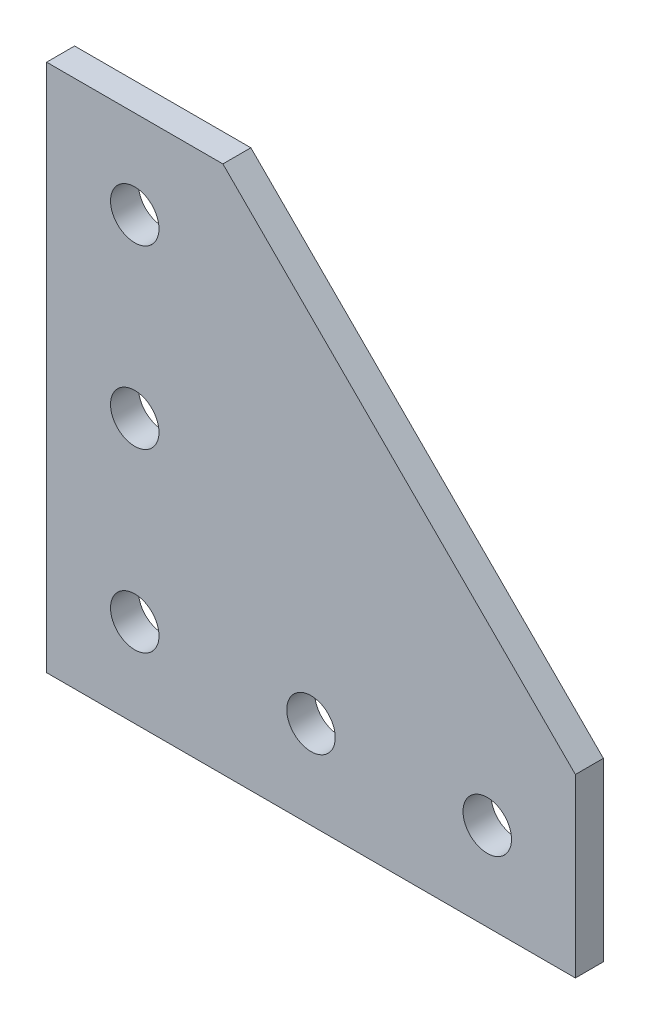
ISO-10303-21;
HEADER;
FILE_DESCRIPTION(('STEP AP214'),'2;1');
FILE_NAME('part.step','',(''),(''),'','','');
FILE_SCHEMA(('AUTOMOTIVE_DESIGN { 1 0 10303 214 1 1 1 1 }'));
ENDSEC;
DATA;
#1=APPLICATION_CONTEXT('core data for automotive mechanical design processes');
#2=APPLICATION_PROTOCOL_DEFINITION('international standard','automotive_design',2000,#1);
#3=PRODUCT_CONTEXT('',#1,'mechanical');
#4=PRODUCT('Part','Part','',(#3));
#5=PRODUCT_RELATED_PRODUCT_CATEGORY('part','',(#4));
#6=PRODUCT_DEFINITION_FORMATION('','',#4);
#7=PRODUCT_DEFINITION_CONTEXT('part definition',#1,'design');
#8=PRODUCT_DEFINITION('design','',#6,#7);
#9=PRODUCT_DEFINITION_SHAPE('','',#8);
#10=(LENGTH_UNIT() NAMED_UNIT(*) SI_UNIT(.MILLI.,.METRE.));
#11=(NAMED_UNIT(*) PLANE_ANGLE_UNIT() SI_UNIT($,.RADIAN.));
#12=(NAMED_UNIT(*) SI_UNIT($,.STERADIAN.) SOLID_ANGLE_UNIT());
#13=UNCERTAINTY_MEASURE_WITH_UNIT(LENGTH_MEASURE(1.E-05),#10,'distance_accuracy_value','');
#14=(GEOMETRIC_REPRESENTATION_CONTEXT(3) GLOBAL_UNCERTAINTY_ASSIGNED_CONTEXT((#13)) GLOBAL_UNIT_ASSIGNED_CONTEXT((#10,
#11,#12)) REPRESENTATION_CONTEXT('',''));
#15=CARTESIAN_POINT('',(0.,0.,0.));
#16=DIRECTION('',(0.,0.,1.));
#17=DIRECTION('',(1.,0.,0.));
#18=AXIS2_PLACEMENT_3D('',#15,#16,#17);
#19=CARTESIAN_POINT('',(60.,0.,3.175));
#20=DIRECTION('',(0.,1.,0.));
#21=DIRECTION('',(-1.,0.,0.));
#22=AXIS2_PLACEMENT_3D('',#19,#20,#21);
#23=PLANE('',#22);
#24=DIRECTION('',(1.,0.,0.));
#25=VECTOR('',#24,1.);
#26=CARTESIAN_POINT('',(60.,0.,0.));
#27=LINE('',#26,#25);
#28=CARTESIAN_POINT('',(0.,0.,0.));
#29=VERTEX_POINT('',#28);
#30=CARTESIAN_POINT('',(60.,0.,0.));
#31=VERTEX_POINT('',#30);
#32=EDGE_CURVE('E107',#29,#31,#27,.T.);
#33=ORIENTED_EDGE('',*,*,#32,.T.);
#34=DIRECTION('',(0.,0.,-1.));
#35=VECTOR('',#34,1.);
#36=CARTESIAN_POINT('',(60.,0.,3.175));
#37=LINE('',#36,#35);
#38=CARTESIAN_POINT('',(60.,0.,3.175));
#39=VERTEX_POINT('',#38);
#40=EDGE_CURVE('E11',#39,#31,#37,.T.);
#41=ORIENTED_EDGE('',*,*,#40,.F.);
#42=DIRECTION('',(1.,0.,0.));
#43=VECTOR('',#42,1.);
#44=CARTESIAN_POINT('',(60.,0.,3.175));
#45=LINE('',#44,#43);
#46=CARTESIAN_POINT('',(0.,0.,3.175));
#47=VERTEX_POINT('',#46);
#48=EDGE_CURVE('E116',#47,#39,#45,.T.);
#49=ORIENTED_EDGE('',*,*,#48,.F.);
#50=DIRECTION('',(0.,0.,-1.));
#51=VECTOR('',#50,1.);
#52=CARTESIAN_POINT('',(0.,0.,3.175));
#53=LINE('',#52,#51);
#54=EDGE_CURVE('E103',#47,#29,#53,.T.);
#55=ORIENTED_EDGE('',*,*,#54,.T.);
#56=EDGE_LOOP('',(#33,#41,#49,#55));
#57=FACE_BOUND('',#56,.T.);
#58=ADVANCED_FACE('F33',(#57),#23,.F.);
#59=CARTESIAN_POINT('',(60.,20.,3.175));
#60=DIRECTION('',(-1.,0.,0.));
#61=DIRECTION('',(0.,-1.,0.));
#62=AXIS2_PLACEMENT_3D('',#59,#60,#61);
#63=PLANE('',#62);
#64=DIRECTION('',(0.,1.,0.));
#65=VECTOR('',#64,1.);
#66=CARTESIAN_POINT('',(60.,20.,0.));
#67=LINE('',#66,#65);
#68=CARTESIAN_POINT('',(60.,20.,0.));
#69=VERTEX_POINT('',#68);
#70=EDGE_CURVE('E110',#31,#69,#67,.T.);
#71=ORIENTED_EDGE('',*,*,#70,.T.);
#72=DIRECTION('',(0.,0.,-1.));
#73=VECTOR('',#72,1.);
#74=CARTESIAN_POINT('',(60.,20.,3.175));
#75=LINE('',#74,#73);
#76=CARTESIAN_POINT('',(60.,20.,3.175));
#77=VERTEX_POINT('',#76);
#78=EDGE_CURVE('E41',#77,#69,#75,.T.);
#79=ORIENTED_EDGE('',*,*,#78,.F.);
#80=DIRECTION('',(0.,1.,0.));
#81=VECTOR('',#80,1.);
#82=CARTESIAN_POINT('',(60.,20.,3.175));
#83=LINE('',#82,#81);
#84=EDGE_CURVE('E83',#39,#77,#83,.T.);
#85=ORIENTED_EDGE('',*,*,#84,.F.);
#86=ORIENTED_EDGE('',*,*,#40,.T.);
#87=EDGE_LOOP('',(#71,#79,#85,#86));
#88=FACE_BOUND('',#87,.T.);
#89=ADVANCED_FACE('F136',(#88),#63,.F.);
#90=CARTESIAN_POINT('',(20.,60.,3.175));
#91=DIRECTION('',(-0.707106781186548,-0.707106781186547,0.));
#92=DIRECTION('',(0.707106781186547,-0.707106781186548,0.));
#93=AXIS2_PLACEMENT_3D('',#90,#91,#92);
#94=PLANE('',#93);
#95=DIRECTION('',(-0.707106781186547,0.707106781186548,0.));
#96=VECTOR('',#95,1.);
#97=CARTESIAN_POINT('',(20.,60.,0.));
#98=LINE('',#97,#96);
#99=CARTESIAN_POINT('',(20.,60.,0.));
#100=VERTEX_POINT('',#99);
#101=EDGE_CURVE('E98',#69,#100,#98,.T.);
#102=ORIENTED_EDGE('',*,*,#101,.T.);
#103=DIRECTION('',(0.,0.,-1.));
#104=VECTOR('',#103,1.);
#105=CARTESIAN_POINT('',(20.,60.,3.175));
#106=LINE('',#105,#104);
#107=CARTESIAN_POINT('',(20.,60.,3.175));
#108=VERTEX_POINT('',#107);
#109=EDGE_CURVE('E95',#108,#100,#106,.T.);
#110=ORIENTED_EDGE('',*,*,#109,.F.);
#111=DIRECTION('',(-0.707106781186547,0.707106781186548,0.));
#112=VECTOR('',#111,1.);
#113=CARTESIAN_POINT('',(20.,60.,3.175));
#114=LINE('',#113,#112);
#115=EDGE_CURVE('E87',#77,#108,#114,.T.);
#116=ORIENTED_EDGE('',*,*,#115,.F.);
#117=ORIENTED_EDGE('',*,*,#78,.T.);
#118=EDGE_LOOP('',(#102,#110,#116,#117));
#119=FACE_BOUND('',#118,.T.);
#120=ADVANCED_FACE('F96',(#119),#94,.F.);
#121=CARTESIAN_POINT('',(0.,60.,3.175));
#122=DIRECTION('',(0.,-1.,0.));
#123=DIRECTION('',(0.,0.,-1.));
#124=AXIS2_PLACEMENT_3D('',#121,#122,#123);
#125=PLANE('',#124);
#126=DIRECTION('',(-1.,0.,0.));
#127=VECTOR('',#126,1.);
#128=CARTESIAN_POINT('',(0.,60.,0.));
#129=LINE('',#128,#127);
#130=CARTESIAN_POINT('',(0.,60.,0.));
#131=VERTEX_POINT('',#130);
#132=EDGE_CURVE('E69',#100,#131,#129,.T.);
#133=ORIENTED_EDGE('',*,*,#132,.T.);
#134=DIRECTION('',(0.,0.,-1.));
#135=VECTOR('',#134,1.);
#136=CARTESIAN_POINT('',(0.,60.,3.175));
#137=LINE('',#136,#135);
#138=CARTESIAN_POINT('',(0.,60.,3.175));
#139=VERTEX_POINT('',#138);
#140=EDGE_CURVE('E99',#139,#131,#137,.T.);
#141=ORIENTED_EDGE('',*,*,#140,.F.);
#142=DIRECTION('',(-1.,0.,0.));
#143=VECTOR('',#142,1.);
#144=CARTESIAN_POINT('',(0.,60.,3.175));
#145=LINE('',#144,#143);
#146=EDGE_CURVE('E91',#108,#139,#145,.T.);
#147=ORIENTED_EDGE('',*,*,#146,.F.);
#148=ORIENTED_EDGE('',*,*,#109,.T.);
#149=EDGE_LOOP('',(#133,#141,#147,#148));
#150=FACE_BOUND('',#149,.T.);
#151=ADVANCED_FACE('F101',(#150),#125,.F.);
#152=CARTESIAN_POINT('',(0.,0.,3.175));
#153=DIRECTION('',(1.,0.,0.));
#154=DIRECTION('',(0.,0.,-1.));
#155=AXIS2_PLACEMENT_3D('',#152,#153,#154);
#156=PLANE('',#155);
#157=DIRECTION('',(0.,-1.,0.));
#158=VECTOR('',#157,1.);
#159=CARTESIAN_POINT('',(0.,0.,0.));
#160=LINE('',#159,#158);
#161=EDGE_CURVE('E75',#131,#29,#160,.T.);
#162=ORIENTED_EDGE('',*,*,#161,.T.);
#163=ORIENTED_EDGE('',*,*,#54,.F.);
#164=DIRECTION('',(0.,-1.,0.));
#165=VECTOR('',#164,1.);
#166=CARTESIAN_POINT('',(0.,0.,3.175));
#167=LINE('',#166,#165);
#168=EDGE_CURVE('E49',#139,#47,#167,.T.);
#169=ORIENTED_EDGE('',*,*,#168,.F.);
#170=ORIENTED_EDGE('',*,*,#140,.T.);
#171=EDGE_LOOP('',(#162,#163,#169,#170));
#172=FACE_BOUND('',#171,.T.);
#173=ADVANCED_FACE('F124',(#172),#156,.F.);
#174=CARTESIAN_POINT('',(0.,0.,3.175));
#175=DIRECTION('',(0.,0.,-1.));
#176=DIRECTION('',(-1.,0.,0.));
#177=AXIS2_PLACEMENT_3D('',#174,#175,#176);
#178=PLANE('',#177);
#179=CARTESIAN_POINT('',(10.,50.,3.175));
#180=DIRECTION('',(0.,0.,1.));
#181=DIRECTION('',(1.,0.,0.));
#182=AXIS2_PLACEMENT_3D('',#179,#180,#181);
#183=CIRCLE('',#182,2.74999999999999);
#184=CARTESIAN_POINT('',(12.75,50.,3.175));
#185=VERTEX_POINT('',#184);
#186=EDGE_CURVE('E228',#185,#185,#183,.T.);
#187=ORIENTED_EDGE('',*,*,#186,.F.);
#188=EDGE_LOOP('',(#187));
#189=FACE_BOUND('',#188,.T.);
#190=CARTESIAN_POINT('',(10.,30.,3.175));
#191=DIRECTION('',(0.,0.,1.));
#192=DIRECTION('',(1.,0.,0.));
#193=AXIS2_PLACEMENT_3D('',#190,#191,#192);
#194=CIRCLE('',#193,2.74999999999999);
#195=CARTESIAN_POINT('',(12.75,30.,3.175));
#196=VERTEX_POINT('',#195);
#197=EDGE_CURVE('E230',#196,#196,#194,.T.);
#198=ORIENTED_EDGE('',*,*,#197,.F.);
#199=EDGE_LOOP('',(#198));
#200=FACE_BOUND('',#199,.T.);
#201=CARTESIAN_POINT('',(50.,10.,3.175));
#202=DIRECTION('',(0.,0.,1.));
#203=DIRECTION('',(1.,0.,0.));
#204=AXIS2_PLACEMENT_3D('',#201,#202,#203);
#205=CIRCLE('',#204,2.74999999999999);
#206=CARTESIAN_POINT('',(52.75,10.,3.175));
#207=VERTEX_POINT('',#206);
#208=EDGE_CURVE('E238',#207,#207,#205,.T.);
#209=ORIENTED_EDGE('',*,*,#208,.F.);
#210=EDGE_LOOP('',(#209));
#211=FACE_BOUND('',#210,.T.);
#212=CARTESIAN_POINT('',(30.,10.,3.175));
#213=DIRECTION('',(0.,0.,1.));
#214=DIRECTION('',(1.,0.,0.));
#215=AXIS2_PLACEMENT_3D('',#212,#213,#214);
#216=CIRCLE('',#215,2.74999999999999);
#217=CARTESIAN_POINT('',(32.75,10.,3.175));
#218=VERTEX_POINT('',#217);
#219=EDGE_CURVE('E244',#218,#218,#216,.T.);
#220=ORIENTED_EDGE('',*,*,#219,.F.);
#221=EDGE_LOOP('',(#220));
#222=FACE_BOUND('',#221,.T.);
#223=CARTESIAN_POINT('',(10.,10.,3.175));
#224=DIRECTION('',(0.,0.,1.));
#225=DIRECTION('',(1.,0.,0.));
#226=AXIS2_PLACEMENT_3D('',#223,#224,#225);
#227=CIRCLE('',#226,2.74999999999999);
#228=CARTESIAN_POINT('',(12.75,10.,3.175));
#229=VERTEX_POINT('',#228);
#230=EDGE_CURVE('E250',#229,#229,#227,.T.);
#231=ORIENTED_EDGE('',*,*,#230,.F.);
#232=EDGE_LOOP('',(#231));
#233=FACE_BOUND('',#232,.T.);
#234=ORIENTED_EDGE('',*,*,#48,.T.);
#235=ORIENTED_EDGE('',*,*,#84,.T.);
#236=ORIENTED_EDGE('',*,*,#115,.T.);
#237=ORIENTED_EDGE('',*,*,#146,.T.);
#238=ORIENTED_EDGE('',*,*,#168,.T.);
#239=EDGE_LOOP('',(#234,#235,#236,#237,#238));
#240=FACE_BOUND('',#239,.T.);
#241=ADVANCED_FACE('F89',(#189,#200,#211,#222,#233,#240),#178,.F.);
#242=CARTESIAN_POINT('',(0.,0.,0.));
#243=DIRECTION('',(0.,0.,-1.));
#244=DIRECTION('',(-1.,0.,0.));
#245=AXIS2_PLACEMENT_3D('',#242,#243,#244);
#246=PLANE('',#245);
#247=CARTESIAN_POINT('',(10.,50.,0.));
#248=DIRECTION('',(0.,0.,1.));
#249=DIRECTION('',(1.,0.,0.));
#250=AXIS2_PLACEMENT_3D('',#247,#248,#249);
#251=CIRCLE('',#250,2.75);
#252=CARTESIAN_POINT('',(12.75,50.,0.));
#253=VERTEX_POINT('',#252);
#254=EDGE_CURVE('E225',#253,#253,#251,.T.);
#255=ORIENTED_EDGE('',*,*,#254,.T.);
#256=EDGE_LOOP('',(#255));
#257=FACE_BOUND('',#256,.T.);
#258=CARTESIAN_POINT('',(10.,30.,0.));
#259=DIRECTION('',(0.,0.,1.));
#260=DIRECTION('',(1.,0.,0.));
#261=AXIS2_PLACEMENT_3D('',#258,#259,#260);
#262=CIRCLE('',#261,2.75);
#263=CARTESIAN_POINT('',(12.75,30.,0.));
#264=VERTEX_POINT('',#263);
#265=EDGE_CURVE('E235',#264,#264,#262,.T.);
#266=ORIENTED_EDGE('',*,*,#265,.T.);
#267=EDGE_LOOP('',(#266));
#268=FACE_BOUND('',#267,.T.);
#269=CARTESIAN_POINT('',(50.,10.,0.));
#270=DIRECTION('',(0.,0.,1.));
#271=DIRECTION('',(1.,0.,0.));
#272=AXIS2_PLACEMENT_3D('',#269,#270,#271);
#273=CIRCLE('',#272,2.75);
#274=CARTESIAN_POINT('',(52.75,10.,0.));
#275=VERTEX_POINT('',#274);
#276=EDGE_CURVE('E241',#275,#275,#273,.T.);
#277=ORIENTED_EDGE('',*,*,#276,.T.);
#278=EDGE_LOOP('',(#277));
#279=FACE_BOUND('',#278,.T.);
#280=CARTESIAN_POINT('',(30.,10.,0.));
#281=DIRECTION('',(0.,0.,1.));
#282=DIRECTION('',(1.,0.,0.));
#283=AXIS2_PLACEMENT_3D('',#280,#281,#282);
#284=CIRCLE('',#283,2.75);
#285=CARTESIAN_POINT('',(32.75,10.,0.));
#286=VERTEX_POINT('',#285);
#287=EDGE_CURVE('E247',#286,#286,#284,.T.);
#288=ORIENTED_EDGE('',*,*,#287,.T.);
#289=EDGE_LOOP('',(#288));
#290=FACE_BOUND('',#289,.T.);
#291=CARTESIAN_POINT('',(10.,10.,0.));
#292=DIRECTION('',(0.,0.,1.));
#293=DIRECTION('',(1.,0.,0.));
#294=AXIS2_PLACEMENT_3D('',#291,#292,#293);
#295=CIRCLE('',#294,2.75);
#296=CARTESIAN_POINT('',(12.75,10.,0.));
#297=VERTEX_POINT('',#296);
#298=EDGE_CURVE('E111',#297,#297,#295,.T.);
#299=ORIENTED_EDGE('',*,*,#298,.T.);
#300=EDGE_LOOP('',(#299));
#301=FACE_BOUND('',#300,.T.);
#302=ORIENTED_EDGE('',*,*,#32,.F.);
#303=ORIENTED_EDGE('',*,*,#161,.F.);
#304=ORIENTED_EDGE('',*,*,#132,.F.);
#305=ORIENTED_EDGE('',*,*,#101,.F.);
#306=ORIENTED_EDGE('',*,*,#70,.F.);
#307=EDGE_LOOP('',(#302,#303,#304,#305,#306));
#308=FACE_BOUND('',#307,.T.);
#309=ADVANCED_FACE('F120',(#257,#268,#279,#290,#301,#308),#246,.T.);
#310=CARTESIAN_POINT('',(10.,10.,3.175));
#311=DIRECTION('',(0.,0.,1.));
#312=DIRECTION('',(1.,0.,0.));
#313=AXIS2_PLACEMENT_3D('',#310,#311,#312);
#314=CYLINDRICAL_SURFACE('',#313,2.74999999999999);
#315=ORIENTED_EDGE('',*,*,#298,.F.);
#316=EDGE_LOOP('',(#315));
#317=FACE_BOUND('',#316,.T.);
#318=ORIENTED_EDGE('',*,*,#230,.T.);
#319=EDGE_LOOP('',(#318));
#320=FACE_BOUND('',#319,.T.);
#321=ADVANCED_FACE('F160',(#317,#320),#314,.F.);
#322=CARTESIAN_POINT('',(30.,10.,3.175));
#323=DIRECTION('',(0.,0.,1.));
#324=DIRECTION('',(1.,0.,0.));
#325=AXIS2_PLACEMENT_3D('',#322,#323,#324);
#326=CYLINDRICAL_SURFACE('',#325,2.75);
#327=ORIENTED_EDGE('',*,*,#287,.F.);
#328=EDGE_LOOP('',(#327));
#329=FACE_BOUND('',#328,.T.);
#330=ORIENTED_EDGE('',*,*,#219,.T.);
#331=EDGE_LOOP('',(#330));
#332=FACE_BOUND('',#331,.T.);
#333=ADVANCED_FACE('F165',(#329,#332),#326,.F.);
#334=CARTESIAN_POINT('',(50.,10.,3.175));
#335=DIRECTION('',(0.,0.,1.));
#336=DIRECTION('',(1.,0.,0.));
#337=AXIS2_PLACEMENT_3D('',#334,#335,#336);
#338=CYLINDRICAL_SURFACE('',#337,2.75);
#339=ORIENTED_EDGE('',*,*,#276,.F.);
#340=EDGE_LOOP('',(#339));
#341=FACE_BOUND('',#340,.T.);
#342=ORIENTED_EDGE('',*,*,#208,.T.);
#343=EDGE_LOOP('',(#342));
#344=FACE_BOUND('',#343,.T.);
#345=ADVANCED_FACE('F177',(#341,#344),#338,.F.);
#346=CARTESIAN_POINT('',(10.,30.,3.175));
#347=DIRECTION('',(0.,0.,1.));
#348=DIRECTION('',(1.,0.,0.));
#349=AXIS2_PLACEMENT_3D('',#346,#347,#348);
#350=CYLINDRICAL_SURFACE('',#349,2.74999999999999);
#351=ORIENTED_EDGE('',*,*,#265,.F.);
#352=EDGE_LOOP('',(#351));
#353=FACE_BOUND('',#352,.T.);
#354=ORIENTED_EDGE('',*,*,#197,.T.);
#355=EDGE_LOOP('',(#354));
#356=FACE_BOUND('',#355,.T.);
#357=ADVANCED_FACE('F187',(#353,#356),#350,.F.);
#358=CARTESIAN_POINT('',(10.,50.,3.175));
#359=DIRECTION('',(0.,0.,1.));
#360=DIRECTION('',(1.,0.,0.));
#361=AXIS2_PLACEMENT_3D('',#358,#359,#360);
#362=CYLINDRICAL_SURFACE('',#361,2.74999999999999);
#363=ORIENTED_EDGE('',*,*,#254,.F.);
#364=EDGE_LOOP('',(#363));
#365=FACE_BOUND('',#364,.T.);
#366=ORIENTED_EDGE('',*,*,#186,.T.);
#367=EDGE_LOOP('',(#366));
#368=FACE_BOUND('',#367,.T.);
#369=ADVANCED_FACE('F208',(#365,#368),#362,.F.);
#370=CLOSED_SHELL('',(#58,#89,#120,#151,#173,#241,#309,#321,#333,#345,#357,#369));
#371=MANIFOLD_SOLID_BREP('B2',#370);
#372=ADVANCED_BREP_SHAPE_REPRESENTATION('',(#18,#371),#14);
#373=SHAPE_DEFINITION_REPRESENTATION(#9,#372);
ENDSEC;
END-ISO-10303-21;
